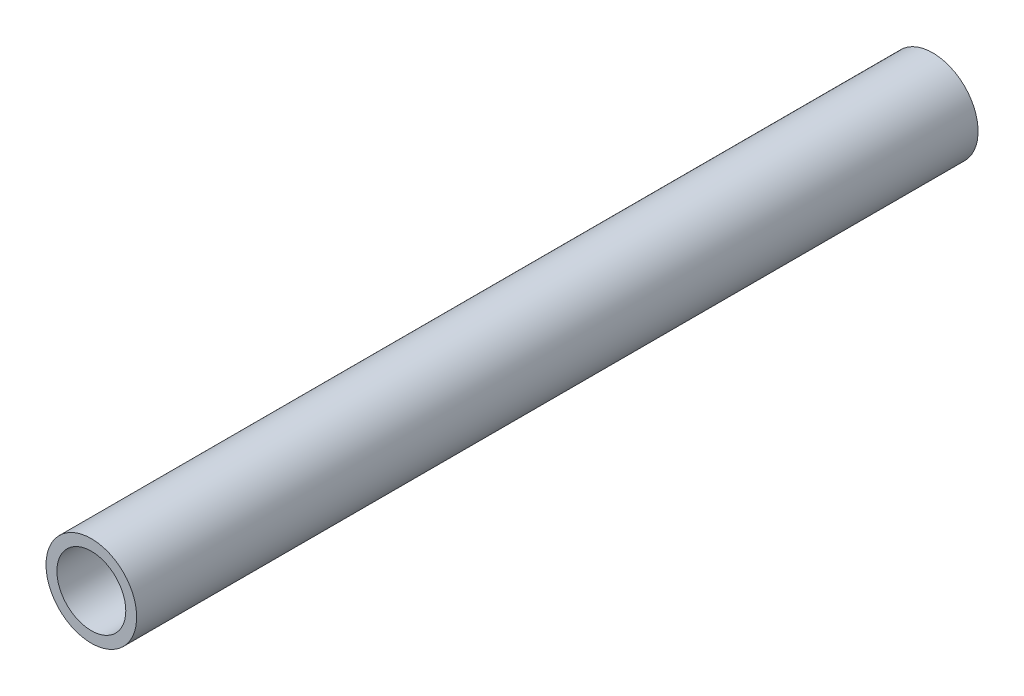
ISO-10303-21;
HEADER;
FILE_DESCRIPTION(('STEP AP214'),'2;1');
FILE_NAME('part.step','',(''),(''),'','','');
FILE_SCHEMA(('AUTOMOTIVE_DESIGN { 1 0 10303 214 1 1 1 1 }'));
ENDSEC;
DATA;
#1=APPLICATION_CONTEXT('core data for automotive mechanical design processes');
#2=APPLICATION_PROTOCOL_DEFINITION('international standard','automotive_design',2000,#1);
#3=PRODUCT_CONTEXT('',#1,'mechanical');
#4=PRODUCT('Part','Part','',(#3));
#5=PRODUCT_RELATED_PRODUCT_CATEGORY('part','',(#4));
#6=PRODUCT_DEFINITION_FORMATION('','',#4);
#7=PRODUCT_DEFINITION_CONTEXT('part definition',#1,'design');
#8=PRODUCT_DEFINITION('design','',#6,#7);
#9=PRODUCT_DEFINITION_SHAPE('','',#8);
#10=(LENGTH_UNIT() NAMED_UNIT(*) SI_UNIT(.MILLI.,.METRE.));
#11=(NAMED_UNIT(*) PLANE_ANGLE_UNIT() SI_UNIT($,.RADIAN.));
#12=(NAMED_UNIT(*) SI_UNIT($,.STERADIAN.) SOLID_ANGLE_UNIT());
#13=UNCERTAINTY_MEASURE_WITH_UNIT(LENGTH_MEASURE(1.E-05),#10,'distance_accuracy_value','');
#14=(GEOMETRIC_REPRESENTATION_CONTEXT(3) GLOBAL_UNCERTAINTY_ASSIGNED_CONTEXT((#13)) GLOBAL_UNIT_ASSIGNED_CONTEXT((#10,
#11,#12)) REPRESENTATION_CONTEXT('',''));
#15=CARTESIAN_POINT('',(0.,0.,0.));
#16=DIRECTION('',(0.,0.,1.));
#17=DIRECTION('',(1.,0.,0.));
#18=AXIS2_PLACEMENT_3D('',#15,#16,#17);
#19=CARTESIAN_POINT('',(300.,300.,462.));
#20=DIRECTION('',(0.,0.,-1.));
#21=DIRECTION('',(-1.,0.,0.));
#22=AXIS2_PLACEMENT_3D('',#19,#20,#21);
#23=CYLINDRICAL_SURFACE('',#22,12.5);
#24=CARTESIAN_POINT('',(300.,300.,462.));
#25=DIRECTION('',(0.,0.,1.));
#26=DIRECTION('',(1.,0.,0.));
#27=AXIS2_PLACEMENT_3D('',#24,#25,#26);
#28=CIRCLE('',#27,12.5);
#29=CARTESIAN_POINT('',(287.5,300.,462.));
#30=VERTEX_POINT('',#29);
#31=EDGE_CURVE('E10',#30,#30,#28,.T.);
#32=CARTESIAN_POINT('',(300.,300.,230.));
#33=DIRECTION('',(0.,0.,1.));
#34=DIRECTION('',(1.,0.,0.));
#35=AXIS2_PLACEMENT_3D('',#32,#33,#34);
#36=CIRCLE('',#35,12.5);
#37=CARTESIAN_POINT('',(287.5,300.,230.));
#38=VERTEX_POINT('',#37);
#39=EDGE_CURVE('E42',#38,#38,#36,.T.);
#40=CARTESIAN_POINT('',(287.5,300.,462.));
#41=CARTESIAN_POINT('',(287.5,300.,459.583333333333));
#42=CARTESIAN_POINT('',(287.5,300.,457.166666666667));
#43=CARTESIAN_POINT('',(287.5,300.,452.333333333333));
#44=CARTESIAN_POINT('',(287.5,300.,449.916666666667));
#45=CARTESIAN_POINT('',(287.5,300.,445.083333333333));
#46=CARTESIAN_POINT('',(287.5,300.,442.666666666667));
#47=CARTESIAN_POINT('',(287.5,300.,437.833333333333));
#48=CARTESIAN_POINT('',(287.5,300.,435.416666666667));
#49=CARTESIAN_POINT('',(287.5,300.,430.583333333333));
#50=CARTESIAN_POINT('',(287.5,300.,428.166666666667));
#51=CARTESIAN_POINT('',(287.5,300.,423.333333333333));
#52=CARTESIAN_POINT('',(287.5,300.,420.916666666667));
#53=CARTESIAN_POINT('',(287.5,300.,416.083333333333));
#54=CARTESIAN_POINT('',(287.5,300.,413.666666666667));
#55=CARTESIAN_POINT('',(287.5,300.,408.833333333333));
#56=CARTESIAN_POINT('',(287.5,300.,406.416666666667));
#57=CARTESIAN_POINT('',(287.5,300.,401.583333333333));
#58=CARTESIAN_POINT('',(287.5,300.,399.166666666667));
#59=CARTESIAN_POINT('',(287.5,300.,394.333333333333));
#60=CARTESIAN_POINT('',(287.5,300.,391.916666666667));
#61=CARTESIAN_POINT('',(287.5,300.,387.083333333333));
#62=CARTESIAN_POINT('',(287.5,300.,384.666666666667));
#63=CARTESIAN_POINT('',(287.5,300.,379.833333333333));
#64=CARTESIAN_POINT('',(287.5,300.,377.416666666667));
#65=CARTESIAN_POINT('',(287.5,300.,372.583333333333));
#66=CARTESIAN_POINT('',(287.5,300.,370.166666666667));
#67=CARTESIAN_POINT('',(287.5,300.,365.333333333333));
#68=CARTESIAN_POINT('',(287.5,300.,362.916666666667));
#69=CARTESIAN_POINT('',(287.5,300.,358.083333333333));
#70=CARTESIAN_POINT('',(287.5,300.,355.666666666667));
#71=CARTESIAN_POINT('',(287.5,300.,350.833333333333));
#72=CARTESIAN_POINT('',(287.5,300.,348.416666666667));
#73=CARTESIAN_POINT('',(287.5,300.,343.583333333333));
#74=CARTESIAN_POINT('',(287.5,300.,341.166666666667));
#75=CARTESIAN_POINT('',(287.5,300.,336.333333333333));
#76=CARTESIAN_POINT('',(287.5,300.,333.916666666667));
#77=CARTESIAN_POINT('',(287.5,300.,329.083333333333));
#78=CARTESIAN_POINT('',(287.5,300.,326.666666666667));
#79=CARTESIAN_POINT('',(287.5,300.,321.833333333333));
#80=CARTESIAN_POINT('',(287.5,300.,319.416666666667));
#81=CARTESIAN_POINT('',(287.5,300.,314.583333333333));
#82=CARTESIAN_POINT('',(287.5,300.,312.166666666667));
#83=CARTESIAN_POINT('',(287.5,300.,307.333333333333));
#84=CARTESIAN_POINT('',(287.5,300.,304.916666666667));
#85=CARTESIAN_POINT('',(287.5,300.,300.083333333333));
#86=CARTESIAN_POINT('',(287.5,300.,297.666666666667));
#87=CARTESIAN_POINT('',(287.5,300.,292.833333333333));
#88=CARTESIAN_POINT('',(287.5,300.,290.416666666667));
#89=CARTESIAN_POINT('',(287.5,300.,285.583333333333));
#90=CARTESIAN_POINT('',(287.5,300.,283.166666666667));
#91=CARTESIAN_POINT('',(287.5,300.,278.333333333333));
#92=CARTESIAN_POINT('',(287.5,300.,275.916666666667));
#93=CARTESIAN_POINT('',(287.5,300.,271.083333333333));
#94=CARTESIAN_POINT('',(287.5,300.,268.666666666667));
#95=CARTESIAN_POINT('',(287.5,300.,263.833333333333));
#96=CARTESIAN_POINT('',(287.5,300.,261.416666666667));
#97=CARTESIAN_POINT('',(287.5,300.,256.583333333333));
#98=CARTESIAN_POINT('',(287.5,300.,254.166666666667));
#99=CARTESIAN_POINT('',(287.5,300.,249.333333333333));
#100=CARTESIAN_POINT('',(287.5,300.,246.916666666667));
#101=CARTESIAN_POINT('',(287.5,300.,242.083333333333));
#102=CARTESIAN_POINT('',(287.5,300.,239.666666666667));
#103=CARTESIAN_POINT('',(287.5,300.,234.833333333333));
#104=CARTESIAN_POINT('',(287.5,300.,232.416666666667));
#105=CARTESIAN_POINT('',(287.5,300.,230.));
#106=B_SPLINE_CURVE_WITH_KNOTS('',3,(#40,#41,#42,#43,#44,#45,#46,#47,#48,#49,#50,#51,#52,#53,
#54,#55,#56,#57,#58,#59,#60,#61,#62,#63,#64,#65,#66,#67,#68,#69,#70,#71,#72,#73,#74,#75,#76,#77,
#78,#79,#80,#81,#82,#83,#84,#85,#86,#87,#88,#89,#90,#91,#92,#93,#94,#95,#96,#97,#98,#99,#100,
#101,#102,#103,#104,#105),.UNSPECIFIED.,.F.,.F.,(4,2,2,2,2,2,2,2,2,2,2,2,2,2,2,2,2,2,2,2,2,2,2,
2,2,2,2,2,2,2,2,2,4),(0.,7.25000000000003,14.5,21.75,29.,36.25,43.5,50.75,58.,65.25,72.5,79.75,
87.,94.25,101.5,108.75,116.,123.25,130.5,137.75,145.,152.25,159.5,166.75,174.,181.25,188.5,
195.75,203.,210.25,217.5,224.75,232.),.UNSPECIFIED.);
#107=EDGE_CURVE('BSEAM40',#30,#38,#106,.T.);
#108=ORIENTED_EDGE('',*,*,#31,.F.);
#109=ORIENTED_EDGE('',*,*,#39,.T.);
#110=ORIENTED_EDGE('',*,*,#107,.T.);
#111=ORIENTED_EDGE('',*,*,#107,.F.);
#112=EDGE_LOOP('',(#108,#110,#109,#111));
#113=FACE_BOUND('',#112,.T.);
#114=ADVANCED_FACE('F40',(#113),#23,.T.);
#115=CARTESIAN_POINT('',(300.,300.,462.));
#116=DIRECTION('',(0.,0.,1.));
#117=DIRECTION('',(1.,0.,0.));
#118=AXIS2_PLACEMENT_3D('',#115,#116,#117);
#119=PLANE('',#118);
#120=CARTESIAN_POINT('',(300.,300.,462.));
#121=DIRECTION('',(0.,0.,1.));
#122=DIRECTION('',(1.,0.,0.));
#123=AXIS2_PLACEMENT_3D('',#120,#121,#122);
#124=CIRCLE('',#123,9.50000000000001);
#125=CARTESIAN_POINT('',(309.5,300.,462.));
#126=VERTEX_POINT('',#125);
#127=EDGE_CURVE('E49',#126,#126,#124,.T.);
#128=ORIENTED_EDGE('',*,*,#127,.F.);
#129=EDGE_LOOP('',(#128));
#130=FACE_BOUND('',#129,.T.);
#131=ORIENTED_EDGE('',*,*,#31,.T.);
#132=EDGE_LOOP('',(#131));
#133=FACE_BOUND('',#132,.T.);
#134=ADVANCED_FACE('F67',(#130,#133),#119,.T.);
#135=CARTESIAN_POINT('',(300.,300.,230.));
#136=DIRECTION('',(0.,0.,1.));
#137=DIRECTION('',(1.,0.,0.));
#138=AXIS2_PLACEMENT_3D('',#135,#136,#137);
#139=PLANE('',#138);
#140=CARTESIAN_POINT('',(300.,300.,230.));
#141=DIRECTION('',(0.,0.,1.));
#142=DIRECTION('',(1.,0.,0.));
#143=AXIS2_PLACEMENT_3D('',#140,#141,#142);
#144=CIRCLE('',#143,9.50000000000001);
#145=CARTESIAN_POINT('',(309.5,300.,230.));
#146=VERTEX_POINT('',#145);
#147=EDGE_CURVE('E37',#146,#146,#144,.T.);
#148=ORIENTED_EDGE('',*,*,#147,.T.);
#149=EDGE_LOOP('',(#148));
#150=FACE_BOUND('',#149,.T.);
#151=ORIENTED_EDGE('',*,*,#39,.F.);
#152=EDGE_LOOP('',(#151));
#153=FACE_BOUND('',#152,.T.);
#154=ADVANCED_FACE('F60',(#150,#153),#139,.F.);
#155=CARTESIAN_POINT('',(300.,300.,210.));
#156=DIRECTION('',(0.,0.,1.));
#157=DIRECTION('',(1.,0.,0.));
#158=AXIS2_PLACEMENT_3D('',#155,#156,#157);
#159=CYLINDRICAL_SURFACE('',#158,9.50000000000001);
#160=ORIENTED_EDGE('',*,*,#127,.T.);
#161=EDGE_LOOP('',(#160));
#162=FACE_BOUND('',#161,.T.);
#163=ORIENTED_EDGE('',*,*,#147,.F.);
#164=EDGE_LOOP('',(#163));
#165=FACE_BOUND('',#164,.T.);
#166=ADVANCED_FACE('F58',(#162,#165),#159,.F.);
#167=CLOSED_SHELL('',(#114,#134,#154,#166));
#168=MANIFOLD_SOLID_BREP('B2',#167);
#169=ADVANCED_BREP_SHAPE_REPRESENTATION('',(#18,#168),#14);
#170=SHAPE_DEFINITION_REPRESENTATION(#9,#169);
ENDSEC;
END-ISO-10303-21;
